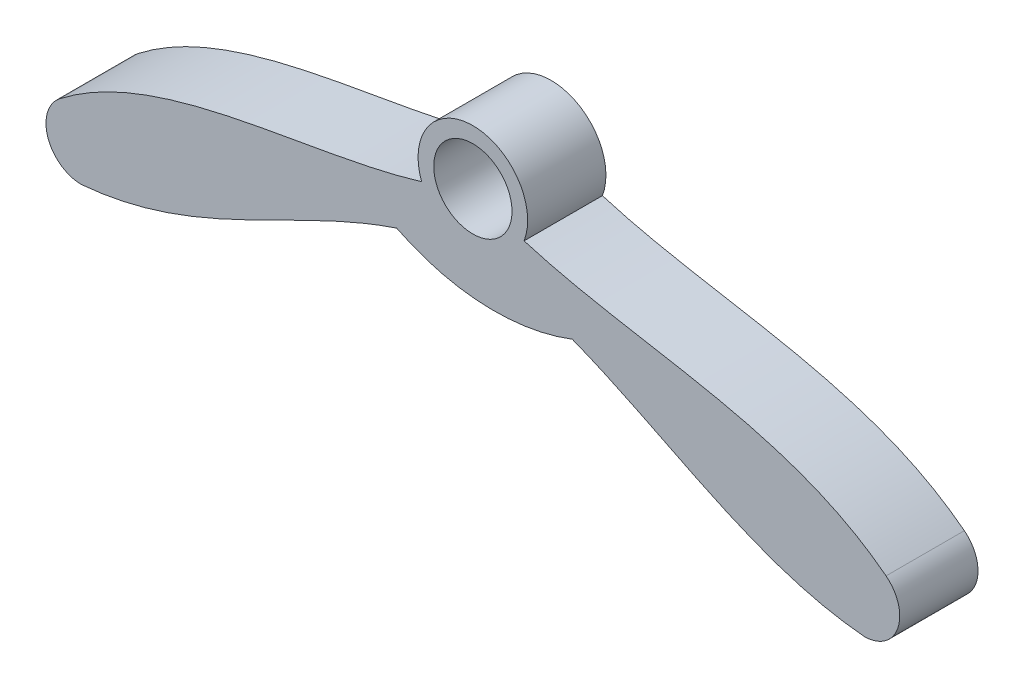
ISO-10303-21;
HEADER;
FILE_DESCRIPTION(('STEP AP214'),'2;1');
FILE_NAME('part.step','',(''),(''),'','','');
FILE_SCHEMA(('AUTOMOTIVE_DESIGN { 1 0 10303 214 1 1 1 1 }'));
ENDSEC;
DATA;
#1=APPLICATION_CONTEXT('core data for automotive mechanical design processes');
#2=APPLICATION_PROTOCOL_DEFINITION('international standard','automotive_design',2000,#1);
#3=PRODUCT_CONTEXT('',#1,'mechanical');
#4=PRODUCT('Part','Part','',(#3));
#5=PRODUCT_RELATED_PRODUCT_CATEGORY('part','',(#4));
#6=PRODUCT_DEFINITION_FORMATION('','',#4);
#7=PRODUCT_DEFINITION_CONTEXT('part definition',#1,'design');
#8=PRODUCT_DEFINITION('design','',#6,#7);
#9=PRODUCT_DEFINITION_SHAPE('','',#8);
#10=(LENGTH_UNIT() NAMED_UNIT(*) SI_UNIT(.MILLI.,.METRE.));
#11=(NAMED_UNIT(*) PLANE_ANGLE_UNIT() SI_UNIT($,.RADIAN.));
#12=(NAMED_UNIT(*) SI_UNIT($,.STERADIAN.) SOLID_ANGLE_UNIT());
#13=UNCERTAINTY_MEASURE_WITH_UNIT(LENGTH_MEASURE(1.E-05),#10,'distance_accuracy_value','');
#14=(GEOMETRIC_REPRESENTATION_CONTEXT(3) GLOBAL_UNCERTAINTY_ASSIGNED_CONTEXT((#13)) GLOBAL_UNIT_ASSIGNED_CONTEXT((#10,
#11,#12)) REPRESENTATION_CONTEXT('',''));
#15=CARTESIAN_POINT('',(0.,0.,0.));
#16=DIRECTION('',(0.,0.,1.));
#17=DIRECTION('',(1.,0.,0.));
#18=AXIS2_PLACEMENT_3D('',#15,#16,#17);
#19=CARTESIAN_POINT('',(-49.9999999999999,-20.,10.));
#20=DIRECTION('',(0.,0.,-1.));
#21=DIRECTION('',(-1.,0.,0.));
#22=AXIS2_PLACEMENT_3D('',#19,#20,#21);
#23=CYLINDRICAL_SURFACE('',#22,4.52880517586229);
#24=CARTESIAN_POINT('',(-49.9999999999999,-20.,0.));
#25=DIRECTION('',(0.,0.,1.));
#26=DIRECTION('',(1.,0.,0.));
#27=AXIS2_PLACEMENT_3D('',#24,#25,#26);
#28=CIRCLE('',#27,4.52880517586229);
#29=CARTESIAN_POINT('',(-52.7829726265033,-16.4271664352996,0.));
#30=VERTEX_POINT('',#29);
#31=CARTESIAN_POINT('',(-50.,-24.5288051758623,0.));
#32=VERTEX_POINT('',#31);
#33=EDGE_CURVE('E181',#30,#32,#28,.T.);
#34=ORIENTED_EDGE('',*,*,#33,.T.);
#35=DIRECTION('',(0.,0.,-1.));
#36=VECTOR('',#35,1.);
#37=CARTESIAN_POINT('',(-50.,-24.5288051758623,10.));
#38=LINE('',#37,#36);
#39=CARTESIAN_POINT('',(-50.,-24.5288051758623,10.));
#40=VERTEX_POINT('',#39);
#41=EDGE_CURVE('E11',#40,#32,#38,.T.);
#42=ORIENTED_EDGE('',*,*,#41,.F.);
#43=CARTESIAN_POINT('',(-49.9999999999999,-20.,10.));
#44=DIRECTION('',(0.,0.,1.));
#45=DIRECTION('',(1.,0.,0.));
#46=AXIS2_PLACEMENT_3D('',#43,#44,#45);
#47=CIRCLE('',#46,4.52880517586229);
#48=CARTESIAN_POINT('',(-52.7829726265033,-16.4271664352996,10.));
#49=VERTEX_POINT('',#48);
#50=EDGE_CURVE('E167',#49,#40,#47,.T.);
#51=ORIENTED_EDGE('',*,*,#50,.F.);
#52=DIRECTION('',(0.,0.,-1.));
#53=VECTOR('',#52,1.);
#54=CARTESIAN_POINT('',(-52.7829726265033,-16.4271664352996,10.));
#55=LINE('',#54,#53);
#56=EDGE_CURVE('E183',#49,#30,#55,.T.);
#57=ORIENTED_EDGE('',*,*,#56,.T.);
#58=EDGE_LOOP('',(#34,#42,#51,#57));
#59=FACE_BOUND('',#58,.T.);
#60=ADVANCED_FACE('F35',(#59),#23,.T.);
#61=CARTESIAN_POINT('',(-50.,-24.5288051758623,10.));
#62=CARTESIAN_POINT('',(-31.4144464506126,-22.8991480394522,10.));
#63=CARTESIAN_POINT('',(-18.4568769413616,-9.10647436028969,10.));
#64=CARTESIAN_POINT('',(0.,-7.,10.));
#65=B_SPLINE_CURVE_WITH_KNOTS('',3,(#61,#62,#63,#64),.UNSPECIFIED.,.F.,.F.,(4,4),(0.,1.),.UNSPECIFIED.);
#66=DIRECTION('',(0.,0.,-1.));
#67=VECTOR('',#66,1.);
#68=SURFACE_OF_LINEAR_EXTRUSION('',#65,#67);
#69=CARTESIAN_POINT('',(-50.,-24.5288051758623,0.));
#70=CARTESIAN_POINT('',(-31.4144464506126,-22.8991480394522,0.));
#71=CARTESIAN_POINT('',(-18.4568769413616,-9.10647436028969,0.));
#72=CARTESIAN_POINT('',(0.,-7.,0.));
#73=B_SPLINE_CURVE_WITH_KNOTS('',3,(#69,#70,#71,#72),.UNSPECIFIED.,.F.,.F.,(4,4),(0.,1.),.UNSPECIFIED.);
#74=CARTESIAN_POINT('',(-9.73613577058847,-9.21354642208356,0.));
#75=VERTEX_POINT('',#74);
#76=EDGE_CURVE('E185',#32,#75,#73,.T.);
#77=ORIENTED_EDGE('',*,*,#76,.T.);
#78=DIRECTION('',(0.,0.,-1.));
#79=VECTOR('',#78,1.);
#80=CARTESIAN_POINT('',(-9.73613577058847,-9.21354642208356,10.));
#81=LINE('',#80,#79);
#82=CARTESIAN_POINT('',(-9.73613577058847,-9.21354642208356,10.));
#83=VERTEX_POINT('',#82);
#84=EDGE_CURVE('E44',#83,#75,#81,.T.);
#85=ORIENTED_EDGE('',*,*,#84,.F.);
#86=EDGE_CURVE('E94',#40,#83,#65,.T.);
#87=ORIENTED_EDGE('',*,*,#86,.F.);
#88=ORIENTED_EDGE('',*,*,#41,.T.);
#89=EDGE_LOOP('',(#77,#85,#87,#88));
#90=FACE_BOUND('',#89,.T.);
#91=ADVANCED_FACE('F172',(#90),#68,.F.);
#92=CARTESIAN_POINT('',(2.69622832420382,15.6433037086206,10.));
#93=DIRECTION('',(0.,0.,-1.));
#94=DIRECTION('',(-1.,0.,0.));
#95=AXIS2_PLACEMENT_3D('',#92,#93,#94);
#96=CYLINDRICAL_SURFACE('',#95,27.7925651102191);
#97=CARTESIAN_POINT('',(2.69622832420382,15.6433037086206,0.));
#98=DIRECTION('',(0.,0.,1.));
#99=DIRECTION('',(1.,0.,0.));
#100=AXIS2_PLACEMENT_3D('',#97,#98,#99);
#101=CIRCLE('',#100,27.7925651102191);
#102=CARTESIAN_POINT('',(12.6996815168107,-10.2865555202509,0.));
#103=VERTEX_POINT('',#102);
#104=EDGE_CURVE('E188',#75,#103,#101,.T.);
#105=ORIENTED_EDGE('',*,*,#104,.T.);
#106=DIRECTION('',(0.,0.,-1.));
#107=VECTOR('',#106,1.);
#108=CARTESIAN_POINT('',(12.6996815168107,-10.2865555202509,10.));
#109=LINE('',#108,#107);
#110=CARTESIAN_POINT('',(12.6996815168107,-10.2865555202509,10.));
#111=VERTEX_POINT('',#110);
#112=EDGE_CURVE('E230',#111,#103,#109,.T.);
#113=ORIENTED_EDGE('',*,*,#112,.F.);
#114=CARTESIAN_POINT('',(2.69622832420382,15.6433037086206,10.));
#115=DIRECTION('',(0.,0.,1.));
#116=DIRECTION('',(1.,0.,0.));
#117=AXIS2_PLACEMENT_3D('',#114,#115,#116);
#118=CIRCLE('',#117,27.7925651102191);
#119=EDGE_CURVE('E158',#83,#111,#118,.T.);
#120=ORIENTED_EDGE('',*,*,#119,.F.);
#121=ORIENTED_EDGE('',*,*,#84,.T.);
#122=EDGE_LOOP('',(#105,#113,#120,#121));
#123=FACE_BOUND('',#122,.T.);
#124=ADVANCED_FACE('F150',(#123),#96,.T.);
#125=CARTESIAN_POINT('',(50.,-24.5288051758623,10.));
#126=CARTESIAN_POINT('',(31.4144464506126,-22.8991480394522,10.));
#127=CARTESIAN_POINT('',(18.4568769413616,-9.10647436028969,10.));
#128=CARTESIAN_POINT('',(0.,-7.,10.));
#129=B_SPLINE_CURVE_WITH_KNOTS('',3,(#125,#126,#127,#128),.UNSPECIFIED.,.F.,.F.,(4,4),(0.,1.),.UNSPECIFIED.);
#130=DIRECTION('',(0.,0.,-1.));
#131=VECTOR('',#130,1.);
#132=SURFACE_OF_LINEAR_EXTRUSION('',#129,#131);
#133=CARTESIAN_POINT('',(50.,-24.5288051758623,0.));
#134=CARTESIAN_POINT('',(31.4144464506126,-22.8991480394522,0.));
#135=CARTESIAN_POINT('',(18.4568769413616,-9.10647436028969,0.));
#136=CARTESIAN_POINT('',(0.,-7.,0.));
#137=B_SPLINE_CURVE_WITH_KNOTS('',3,(#133,#134,#135,#136),.UNSPECIFIED.,.F.,.F.,(4,4),(0.,1.),.UNSPECIFIED.);
#138=CARTESIAN_POINT('',(50.,-24.5288051758623,0.));
#139=VERTEX_POINT('',#138);
#140=EDGE_CURVE('E200',#139,#103,#137,.T.);
#141=ORIENTED_EDGE('',*,*,#140,.F.);
#142=DIRECTION('',(0.,0.,-1.));
#143=VECTOR('',#142,1.);
#144=CARTESIAN_POINT('',(50.,-24.5288051758623,10.));
#145=LINE('',#144,#143);
#146=CARTESIAN_POINT('',(50.,-24.5288051758623,10.));
#147=VERTEX_POINT('',#146);
#148=EDGE_CURVE('E228',#147,#139,#145,.T.);
#149=ORIENTED_EDGE('',*,*,#148,.F.);
#150=EDGE_CURVE('E128',#147,#111,#129,.T.);
#151=ORIENTED_EDGE('',*,*,#150,.T.);
#152=ORIENTED_EDGE('',*,*,#112,.T.);
#153=EDGE_LOOP('',(#141,#149,#151,#152));
#154=FACE_BOUND('',#153,.T.);
#155=ADVANCED_FACE('F146',(#154),#132,.T.);
#156=CARTESIAN_POINT('',(49.9999999999999,-20.,10.));
#157=DIRECTION('',(0.,0.,-1.));
#158=DIRECTION('',(-1.,0.,0.));
#159=AXIS2_PLACEMENT_3D('',#156,#157,#158);
#160=CYLINDRICAL_SURFACE('',#159,4.52880517586229);
#161=CARTESIAN_POINT('',(49.9999999999999,-20.,0.));
#162=DIRECTION('',(0.,0.,1.));
#163=DIRECTION('',(1.,0.,0.));
#164=AXIS2_PLACEMENT_3D('',#161,#162,#163);
#165=CIRCLE('',#164,4.52880517586229);
#166=CARTESIAN_POINT('',(52.7829726265033,-16.4271664352996,0.));
#167=VERTEX_POINT('',#166);
#168=EDGE_CURVE('E205',#167,#139,#165,.F.);
#169=ORIENTED_EDGE('',*,*,#168,.F.);
#170=DIRECTION('',(0.,0.,-1.));
#171=VECTOR('',#170,1.);
#172=CARTESIAN_POINT('',(52.7829726265033,-16.4271664352996,10.));
#173=LINE('',#172,#171);
#174=CARTESIAN_POINT('',(52.7829726265033,-16.4271664352996,10.));
#175=VERTEX_POINT('',#174);
#176=EDGE_CURVE('E116',#175,#167,#173,.T.);
#177=ORIENTED_EDGE('',*,*,#176,.F.);
#178=CARTESIAN_POINT('',(49.9999999999999,-20.,10.));
#179=DIRECTION('',(0.,0.,1.));
#180=DIRECTION('',(1.,0.,0.));
#181=AXIS2_PLACEMENT_3D('',#178,#179,#180);
#182=CIRCLE('',#181,4.52880517586229);
#183=EDGE_CURVE('E126',#175,#147,#182,.F.);
#184=ORIENTED_EDGE('',*,*,#183,.T.);
#185=ORIENTED_EDGE('',*,*,#148,.T.);
#186=EDGE_LOOP('',(#169,#177,#184,#185));
#187=FACE_BOUND('',#186,.T.);
#188=ADVANCED_FACE('F142',(#187),#160,.T.);
#189=CARTESIAN_POINT('',(0.,0.,10.));
#190=CARTESIAN_POINT('',(15.4923764911296,-7.37267141083325,10.));
#191=CARTESIAN_POINT('',(38.086817466896,-4.97995044177683,10.));
#192=CARTESIAN_POINT('',(52.7829726265033,-16.4271664352996,10.));
#193=B_SPLINE_CURVE_WITH_KNOTS('',3,(#189,#190,#191,#192),.UNSPECIFIED.,.F.,.F.,(4,4),(0.,1.),.UNSPECIFIED.);
#194=DIRECTION('',(0.,0.,-1.));
#195=VECTOR('',#194,1.);
#196=SURFACE_OF_LINEAR_EXTRUSION('',#193,#195);
#197=CARTESIAN_POINT('',(0.,0.,0.));
#198=CARTESIAN_POINT('',(15.4923764911296,-7.37267141083325,0.));
#199=CARTESIAN_POINT('',(38.086817466896,-4.97995044177683,0.));
#200=CARTESIAN_POINT('',(52.7829726265033,-16.4271664352996,0.));
#201=B_SPLINE_CURVE_WITH_KNOTS('',3,(#197,#198,#199,#200),.UNSPECIFIED.,.F.,.F.,(4,4),(0.,1.),.UNSPECIFIED.);
#202=CARTESIAN_POINT('',(6.54393444401257,-2.48534142372148,0.));
#203=VERTEX_POINT('',#202);
#204=EDGE_CURVE('E115',#203,#167,#201,.T.);
#205=ORIENTED_EDGE('',*,*,#204,.F.);
#206=DIRECTION('',(0.,0.,-1.));
#207=VECTOR('',#206,1.);
#208=CARTESIAN_POINT('',(6.54393444401257,-2.48534142372148,10.));
#209=LINE('',#208,#207);
#210=CARTESIAN_POINT('',(6.54393444401257,-2.48534142372148,10.));
#211=VERTEX_POINT('',#210);
#212=EDGE_CURVE('E109',#211,#203,#209,.T.);
#213=ORIENTED_EDGE('',*,*,#212,.F.);
#214=EDGE_CURVE('E113',#211,#175,#193,.T.);
#215=ORIENTED_EDGE('',*,*,#214,.T.);
#216=ORIENTED_EDGE('',*,*,#176,.T.);
#217=EDGE_LOOP('',(#205,#213,#215,#216));
#218=FACE_BOUND('',#217,.T.);
#219=ADVANCED_FACE('F111',(#218),#196,.T.);
#220=CARTESIAN_POINT('',(0.,0.,10.));
#221=DIRECTION('',(0.,0.,-1.));
#222=DIRECTION('',(-1.,0.,0.));
#223=AXIS2_PLACEMENT_3D('',#220,#221,#222);
#224=CYLINDRICAL_SURFACE('',#223,7.);
#225=CARTESIAN_POINT('',(0.,0.,0.));
#226=DIRECTION('',(0.,0.,1.));
#227=DIRECTION('',(1.,0.,0.));
#228=AXIS2_PLACEMENT_3D('',#225,#226,#227);
#229=CIRCLE('',#228,7.);
#230=CARTESIAN_POINT('',(-6.54393444401257,-2.48534142372148,0.));
#231=VERTEX_POINT('',#230);
#232=EDGE_CURVE('E80',#203,#231,#229,.T.);
#233=ORIENTED_EDGE('',*,*,#232,.T.);
#234=DIRECTION('',(0.,0.,-1.));
#235=VECTOR('',#234,1.);
#236=CARTESIAN_POINT('',(-6.54393444401257,-2.48534142372148,10.));
#237=LINE('',#236,#235);
#238=CARTESIAN_POINT('',(-6.54393444401257,-2.48534142372148,10.));
#239=VERTEX_POINT('',#238);
#240=EDGE_CURVE('E117',#239,#231,#237,.T.);
#241=ORIENTED_EDGE('',*,*,#240,.F.);
#242=CARTESIAN_POINT('',(0.,0.,10.));
#243=DIRECTION('',(0.,0.,1.));
#244=DIRECTION('',(1.,0.,0.));
#245=AXIS2_PLACEMENT_3D('',#242,#243,#244);
#246=CIRCLE('',#245,7.);
#247=EDGE_CURVE('E119',#211,#239,#246,.T.);
#248=ORIENTED_EDGE('',*,*,#247,.F.);
#249=ORIENTED_EDGE('',*,*,#212,.T.);
#250=EDGE_LOOP('',(#233,#241,#248,#249));
#251=FACE_BOUND('',#250,.T.);
#252=ADVANCED_FACE('F120',(#251),#224,.T.);
#253=CARTESIAN_POINT('',(0.,0.,10.));
#254=DIRECTION('',(0.,0.,-1.));
#255=DIRECTION('',(-1.,0.,0.));
#256=AXIS2_PLACEMENT_3D('',#253,#254,#255);
#257=CYLINDRICAL_SURFACE('',#256,5.);
#258=CARTESIAN_POINT('',(0.,0.,10.));
#259=DIRECTION('',(0.,0.,1.));
#260=DIRECTION('',(1.,0.,0.));
#261=AXIS2_PLACEMENT_3D('',#258,#259,#260);
#262=CIRCLE('',#261,5.);
#263=CARTESIAN_POINT('',(5.,0.,10.));
#264=VERTEX_POINT('',#263);
#265=EDGE_CURVE('E221',#264,#264,#262,.T.);
#266=ORIENTED_EDGE('',*,*,#265,.T.);
#267=EDGE_LOOP('',(#266));
#268=FACE_BOUND('',#267,.T.);
#269=CARTESIAN_POINT('',(0.,0.,0.));
#270=DIRECTION('',(0.,0.,1.));
#271=DIRECTION('',(1.,0.,0.));
#272=AXIS2_PLACEMENT_3D('',#269,#270,#271);
#273=CIRCLE('',#272,5.);
#274=CARTESIAN_POINT('',(5.,0.,0.));
#275=VERTEX_POINT('',#274);
#276=EDGE_CURVE('E186',#275,#275,#273,.T.);
#277=ORIENTED_EDGE('',*,*,#276,.F.);
#278=EDGE_LOOP('',(#277));
#279=FACE_BOUND('',#278,.T.);
#280=ADVANCED_FACE('F37',(#268,#279),#257,.F.);
#281=CARTESIAN_POINT('',(0.,0.,10.));
#282=CARTESIAN_POINT('',(-15.4923764911296,-7.37267141083325,10.));
#283=CARTESIAN_POINT('',(-38.086817466896,-4.97995044177683,10.));
#284=CARTESIAN_POINT('',(-52.7829726265033,-16.4271664352996,10.));
#285=B_SPLINE_CURVE_WITH_KNOTS('',3,(#281,#282,#283,#284),.UNSPECIFIED.,.F.,.F.,(4,4),(0.,1.),.UNSPECIFIED.);
#286=DIRECTION('',(0.,0.,-1.));
#287=VECTOR('',#286,1.);
#288=SURFACE_OF_LINEAR_EXTRUSION('',#285,#287);
#289=CARTESIAN_POINT('',(0.,0.,0.));
#290=CARTESIAN_POINT('',(-15.4923764911296,-7.37267141083325,0.));
#291=CARTESIAN_POINT('',(-38.086817466896,-4.97995044177683,0.));
#292=CARTESIAN_POINT('',(-52.7829726265033,-16.4271664352996,0.));
#293=B_SPLINE_CURVE_WITH_KNOTS('',3,(#289,#290,#291,#292),.UNSPECIFIED.,.F.,.F.,(4,4),(0.,1.),.UNSPECIFIED.);
#294=EDGE_CURVE('E86',#231,#30,#293,.T.);
#295=ORIENTED_EDGE('',*,*,#294,.T.);
#296=ORIENTED_EDGE('',*,*,#56,.F.);
#297=EDGE_CURVE('E52',#239,#49,#285,.T.);
#298=ORIENTED_EDGE('',*,*,#297,.F.);
#299=ORIENTED_EDGE('',*,*,#240,.T.);
#300=EDGE_LOOP('',(#295,#296,#298,#299));
#301=FACE_BOUND('',#300,.T.);
#302=ADVANCED_FACE('F245',(#301),#288,.F.);
#303=CARTESIAN_POINT('',(0.,0.,10.));
#304=DIRECTION('',(0.,0.,1.));
#305=DIRECTION('',(1.,0.,0.));
#306=AXIS2_PLACEMENT_3D('',#303,#304,#305);
#307=PLANE('',#306);
#308=ORIENTED_EDGE('',*,*,#265,.F.);
#309=EDGE_LOOP('',(#308));
#310=FACE_BOUND('',#309,.T.);
#311=ORIENTED_EDGE('',*,*,#50,.T.);
#312=ORIENTED_EDGE('',*,*,#86,.T.);
#313=ORIENTED_EDGE('',*,*,#119,.T.);
#314=ORIENTED_EDGE('',*,*,#150,.F.);
#315=ORIENTED_EDGE('',*,*,#183,.F.);
#316=ORIENTED_EDGE('',*,*,#214,.F.);
#317=ORIENTED_EDGE('',*,*,#247,.T.);
#318=ORIENTED_EDGE('',*,*,#297,.T.);
#319=EDGE_LOOP('',(#311,#312,#313,#314,#315,#316,#317,#318));
#320=FACE_BOUND('',#319,.T.);
#321=ADVANCED_FACE('F123',(#310,#320),#307,.T.);
#322=CARTESIAN_POINT('',(0.,0.,0.));
#323=DIRECTION('',(0.,0.,1.));
#324=DIRECTION('',(1.,0.,0.));
#325=AXIS2_PLACEMENT_3D('',#322,#323,#324);
#326=PLANE('',#325);
#327=ORIENTED_EDGE('',*,*,#276,.T.);
#328=EDGE_LOOP('',(#327));
#329=FACE_BOUND('',#328,.T.);
#330=ORIENTED_EDGE('',*,*,#33,.F.);
#331=ORIENTED_EDGE('',*,*,#294,.F.);
#332=ORIENTED_EDGE('',*,*,#232,.F.);
#333=ORIENTED_EDGE('',*,*,#204,.T.);
#334=ORIENTED_EDGE('',*,*,#168,.T.);
#335=ORIENTED_EDGE('',*,*,#140,.T.);
#336=ORIENTED_EDGE('',*,*,#104,.F.);
#337=ORIENTED_EDGE('',*,*,#76,.F.);
#338=EDGE_LOOP('',(#330,#331,#332,#333,#334,#335,#336,#337));
#339=FACE_BOUND('',#338,.T.);
#340=ADVANCED_FACE('F236',(#329,#339),#326,.F.);
#341=CLOSED_SHELL('',(#60,#91,#124,#155,#188,#219,#252,#280,#302,#321,#340));
#342=MANIFOLD_SOLID_BREP('B2',#341);
#343=ADVANCED_BREP_SHAPE_REPRESENTATION('',(#18,#342),#14);
#344=SHAPE_DEFINITION_REPRESENTATION(#9,#343);
ENDSEC;
END-ISO-10303-21;
